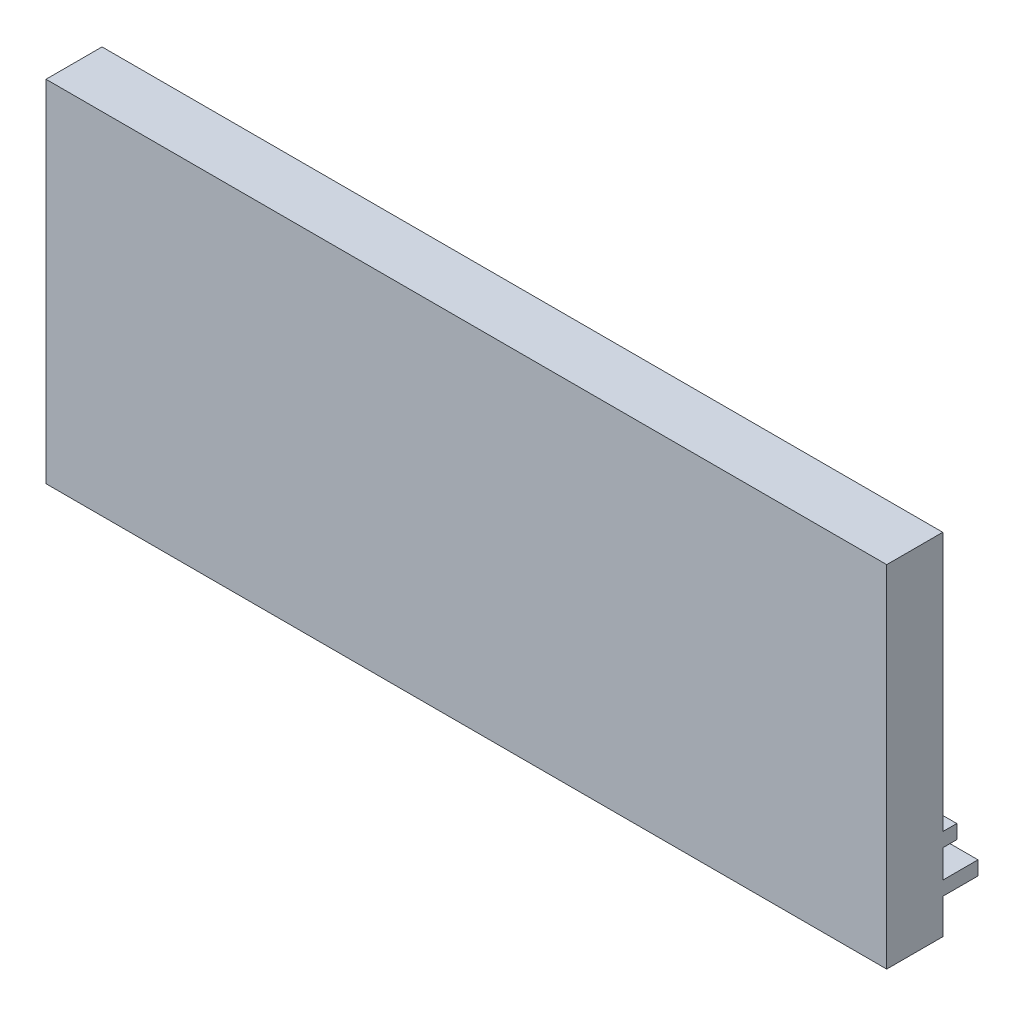
ISO-10303-21;
HEADER;
FILE_DESCRIPTION(('STEP AP214'),'2;1');
FILE_NAME('part.step','',(''),(''),'','','');
FILE_SCHEMA(('AUTOMOTIVE_DESIGN { 1 0 10303 214 1 1 1 1 }'));
ENDSEC;
DATA;
#1=APPLICATION_CONTEXT('core data for automotive mechanical design processes');
#2=APPLICATION_PROTOCOL_DEFINITION('international standard','automotive_design',2000,#1);
#3=PRODUCT_CONTEXT('',#1,'mechanical');
#4=PRODUCT('Part','Part','',(#3));
#5=PRODUCT_RELATED_PRODUCT_CATEGORY('part','',(#4));
#6=PRODUCT_DEFINITION_FORMATION('','',#4);
#7=PRODUCT_DEFINITION_CONTEXT('part definition',#1,'design');
#8=PRODUCT_DEFINITION('design','',#6,#7);
#9=PRODUCT_DEFINITION_SHAPE('','',#8);
#10=(LENGTH_UNIT() NAMED_UNIT(*) SI_UNIT(.MILLI.,.METRE.));
#11=(NAMED_UNIT(*) PLANE_ANGLE_UNIT() SI_UNIT($,.RADIAN.));
#12=(NAMED_UNIT(*) SI_UNIT($,.STERADIAN.) SOLID_ANGLE_UNIT());
#13=UNCERTAINTY_MEASURE_WITH_UNIT(LENGTH_MEASURE(1.E-05),#10,'distance_accuracy_value','');
#14=(GEOMETRIC_REPRESENTATION_CONTEXT(3) GLOBAL_UNCERTAINTY_ASSIGNED_CONTEXT((#13)) GLOBAL_UNIT_ASSIGNED_CONTEXT((#10,
#11,#12)) REPRESENTATION_CONTEXT('',''));
#15=CARTESIAN_POINT('',(0.,0.,0.));
#16=DIRECTION('',(0.,0.,1.));
#17=DIRECTION('',(1.,0.,0.));
#18=AXIS2_PLACEMENT_3D('',#15,#16,#17);
#19=CARTESIAN_POINT('',(0.,0.,0.));
#20=DIRECTION('',(0.,0.,1.));
#21=DIRECTION('',(1.,0.,0.));
#22=AXIS2_PLACEMENT_3D('',#19,#20,#21);
#23=PLANE('',#22);
#24=DIRECTION('',(-1.,0.,0.));
#25=VECTOR('',#24,1.);
#26=CARTESIAN_POINT('',(34.4162435328224,-4.77919281725888,0.));
#27=LINE('',#26,#25);
#28=CARTESIAN_POINT('',(34.4162435328224,-4.77919281725888,0.));
#29=VERTEX_POINT('',#28);
#30=CARTESIAN_POINT('',(-5.58375646717765,-4.77919281725888,0.));
#31=VERTEX_POINT('',#30);
#32=EDGE_CURVE('E256',#29,#31,#27,.T.);
#33=ORIENTED_EDGE('',*,*,#32,.F.);
#34=DIRECTION('',(0.,1.,0.));
#35=VECTOR('',#34,1.);
#36=CARTESIAN_POINT('',(34.4162436548223,14.7208121827411,0.));
#37=LINE('',#36,#35);
#38=CARTESIAN_POINT('',(34.4162435328223,-6.77919281725891,0.));
#39=VERTEX_POINT('',#38);
#40=EDGE_CURVE('E153',#39,#29,#37,.T.);
#41=ORIENTED_EDGE('',*,*,#40,.F.);
#42=DIRECTION('',(1.,0.,0.));
#43=VECTOR('',#42,1.);
#44=CARTESIAN_POINT('',(-5.58375646717766,-6.77919281725888,0.));
#45=LINE('',#44,#43);
#46=CARTESIAN_POINT('',(-5.58375646717766,-6.77919281725888,0.));
#47=VERTEX_POINT('',#46);
#48=EDGE_CURVE('E158',#47,#39,#45,.T.);
#49=ORIENTED_EDGE('',*,*,#48,.F.);
#50=DIRECTION('',(0.,1.,0.));
#51=VECTOR('',#50,1.);
#52=CARTESIAN_POINT('',(-5.58375646717766,-6.77919281725888,0.));
#53=LINE('',#52,#51);
#54=CARTESIAN_POINT('',(-5.58375646717766,-7.77919281725888,0.));
#55=VERTEX_POINT('',#54);
#56=EDGE_CURVE('E63',#55,#47,#53,.T.);
#57=ORIENTED_EDGE('',*,*,#56,.F.);
#58=DIRECTION('',(-1.,0.,0.));
#59=VECTOR('',#58,1.);
#60=CARTESIAN_POINT('',(-5.58375646717766,-7.77919281725888,0.));
#61=LINE('',#60,#59);
#62=CARTESIAN_POINT('',(34.4162436548223,-7.77919281725889,0.));
#63=VERTEX_POINT('',#62);
#64=EDGE_CURVE('E169',#63,#55,#61,.T.);
#65=ORIENTED_EDGE('',*,*,#64,.F.);
#66=CARTESIAN_POINT('',(34.4162436548223,-10.2791878172589,0.));
#67=VERTEX_POINT('',#66);
#68=EDGE_CURVE('E221',#67,#63,#37,.T.);
#69=ORIENTED_EDGE('',*,*,#68,.F.);
#70=DIRECTION('',(1.,0.,0.));
#71=VECTOR('',#70,1.);
#72=CARTESIAN_POINT('',(-25.5837563451777,-10.2791878172589,0.));
#73=LINE('',#72,#71);
#74=CARTESIAN_POINT('',(-25.5837563451777,-10.2791878172589,0.));
#75=VERTEX_POINT('',#74);
#76=EDGE_CURVE('E217',#75,#67,#73,.T.);
#77=ORIENTED_EDGE('',*,*,#76,.F.);
#78=DIRECTION('',(0.,-1.,0.));
#79=VECTOR('',#78,1.);
#80=CARTESIAN_POINT('',(-25.5837563451777,14.7208121827411,0.));
#81=LINE('',#80,#79);
#82=CARTESIAN_POINT('',(-25.5837563451777,14.7208121827411,0.));
#83=VERTEX_POINT('',#82);
#84=EDGE_CURVE('E198',#83,#75,#81,.T.);
#85=ORIENTED_EDGE('',*,*,#84,.F.);
#86=DIRECTION('',(-1.,0.,0.));
#87=VECTOR('',#86,1.);
#88=CARTESIAN_POINT('',(-25.5837563451777,14.7208121827411,0.));
#89=LINE('',#88,#87);
#90=CARTESIAN_POINT('',(34.4162436548223,14.7208121827411,0.));
#91=VERTEX_POINT('',#90);
#92=EDGE_CURVE('E204',#91,#83,#89,.T.);
#93=ORIENTED_EDGE('',*,*,#92,.F.);
#94=CARTESIAN_POINT('',(34.4162436548223,-3.77919281725888,0.));
#95=VERTEX_POINT('',#94);
#96=EDGE_CURVE('E220',#95,#91,#37,.T.);
#97=ORIENTED_EDGE('',*,*,#96,.F.);
#98=DIRECTION('',(1.,0.,0.));
#99=VECTOR('',#98,1.);
#100=CARTESIAN_POINT('',(34.4162435328224,-3.77919281725888,0.));
#101=LINE('',#100,#99);
#102=CARTESIAN_POINT('',(-5.58375646717766,-3.77919281725888,0.));
#103=VERTEX_POINT('',#102);
#104=EDGE_CURVE('E147',#103,#95,#101,.T.);
#105=ORIENTED_EDGE('',*,*,#104,.F.);
#106=DIRECTION('',(0.,1.,0.));
#107=VECTOR('',#106,1.);
#108=CARTESIAN_POINT('',(-5.58375646717766,-3.77919281725888,0.));
#109=LINE('',#108,#107);
#110=EDGE_CURVE('E395',#31,#103,#109,.T.);
#111=ORIENTED_EDGE('',*,*,#110,.F.);
#112=EDGE_LOOP('',(#33,#41,#49,#57,#65,#69,#77,#85,#93,#97,#105,#111));
#113=FACE_BOUND('',#112,.T.);
#114=ADVANCED_FACE('F39',(#113),#23,.F.);
#115=CARTESIAN_POINT('',(-25.5837563451777,14.7208121827411,4.));
#116=DIRECTION('',(1.,0.,0.));
#117=DIRECTION('',(0.,0.,-1.));
#118=AXIS2_PLACEMENT_3D('',#115,#116,#117);
#119=PLANE('',#118);
#120=ORIENTED_EDGE('',*,*,#84,.T.);
#121=DIRECTION('',(0.,0.,-1.));
#122=VECTOR('',#121,1.);
#123=CARTESIAN_POINT('',(-25.5837563451777,-10.2791878172589,4.));
#124=LINE('',#123,#122);
#125=CARTESIAN_POINT('',(-25.5837563451777,-10.2791878172589,4.));
#126=VERTEX_POINT('',#125);
#127=EDGE_CURVE('E11',#126,#75,#124,.T.);
#128=ORIENTED_EDGE('',*,*,#127,.F.);
#129=DIRECTION('',(0.,-1.,0.));
#130=VECTOR('',#129,1.);
#131=CARTESIAN_POINT('',(-25.5837563451777,14.7208121827411,4.));
#132=LINE('',#131,#130);
#133=CARTESIAN_POINT('',(-25.5837563451777,14.7208121827411,4.));
#134=VERTEX_POINT('',#133);
#135=EDGE_CURVE('E199',#134,#126,#132,.T.);
#136=ORIENTED_EDGE('',*,*,#135,.F.);
#137=DIRECTION('',(0.,0.,-1.));
#138=VECTOR('',#137,1.);
#139=CARTESIAN_POINT('',(-25.5837563451777,14.7208121827411,4.));
#140=LINE('',#139,#138);
#141=EDGE_CURVE('E213',#134,#83,#140,.T.);
#142=ORIENTED_EDGE('',*,*,#141,.T.);
#143=EDGE_LOOP('',(#120,#128,#136,#142));
#144=FACE_BOUND('',#143,.T.);
#145=ADVANCED_FACE('F41',(#144),#119,.F.);
#146=CARTESIAN_POINT('',(-25.5837563451777,-10.2791878172589,4.));
#147=DIRECTION('',(0.,1.,0.));
#148=DIRECTION('',(0.,0.,1.));
#149=AXIS2_PLACEMENT_3D('',#146,#147,#148);
#150=PLANE('',#149);
#151=ORIENTED_EDGE('',*,*,#76,.T.);
#152=DIRECTION('',(0.,0.,-1.));
#153=VECTOR('',#152,1.);
#154=CARTESIAN_POINT('',(34.4162436548223,-10.2791878172589,4.));
#155=LINE('',#154,#153);
#156=CARTESIAN_POINT('',(34.4162436548223,-10.2791878172589,4.));
#157=VERTEX_POINT('',#156);
#158=EDGE_CURVE('E48',#157,#67,#155,.T.);
#159=ORIENTED_EDGE('',*,*,#158,.F.);
#160=DIRECTION('',(1.,0.,0.));
#161=VECTOR('',#160,1.);
#162=CARTESIAN_POINT('',(-25.5837563451777,-10.2791878172589,4.));
#163=LINE('',#162,#161);
#164=EDGE_CURVE('E203',#126,#157,#163,.T.);
#165=ORIENTED_EDGE('',*,*,#164,.F.);
#166=ORIENTED_EDGE('',*,*,#127,.T.);
#167=EDGE_LOOP('',(#151,#159,#165,#166));
#168=FACE_BOUND('',#167,.T.);
#169=ADVANCED_FACE('F271',(#168),#150,.F.);
#170=CARTESIAN_POINT('',(34.4162436548223,14.7208121827411,4.));
#171=DIRECTION('',(-1.,0.,0.));
#172=DIRECTION('',(0.,0.,1.));
#173=AXIS2_PLACEMENT_3D('',#170,#171,#172);
#174=PLANE('',#173);
#175=ORIENTED_EDGE('',*,*,#68,.T.);
#176=DIRECTION('',(0.,0.,1.));
#177=VECTOR('',#176,1.);
#178=CARTESIAN_POINT('',(34.4162435328223,-7.77919281725889,-2.5146));
#179=LINE('',#178,#177);
#180=CARTESIAN_POINT('',(34.4162435328223,-7.77919281725889,-2.5146));
#181=VERTEX_POINT('',#180);
#182=EDGE_CURVE('E187',#181,#63,#179,.T.);
#183=ORIENTED_EDGE('',*,*,#182,.F.);
#184=DIRECTION('',(0.,-1.,0.));
#185=VECTOR('',#184,1.);
#186=CARTESIAN_POINT('',(34.4162435328223,-6.77919281725891,-2.5146));
#187=LINE('',#186,#185);
#188=CARTESIAN_POINT('',(34.4162435328223,-6.77919281725891,-2.5146));
#189=VERTEX_POINT('',#188);
#190=EDGE_CURVE('E172',#189,#181,#187,.T.);
#191=ORIENTED_EDGE('',*,*,#190,.F.);
#192=DIRECTION('',(0.,0.,1.));
#193=VECTOR('',#192,1.);
#194=CARTESIAN_POINT('',(34.4162435328223,-6.77919281725891,-2.5146));
#195=LINE('',#194,#193);
#196=EDGE_CURVE('E191',#189,#39,#195,.T.);
#197=ORIENTED_EDGE('',*,*,#196,.T.);
#198=ORIENTED_EDGE('',*,*,#40,.T.);
#199=DIRECTION('',(0.,0.,1.));
#200=VECTOR('',#199,1.);
#201=CARTESIAN_POINT('',(34.4162435328224,-4.77919281725888,-1.));
#202=LINE('',#201,#200);
#203=CARTESIAN_POINT('',(34.4162435328224,-4.77919281725888,-1.));
#204=VERTEX_POINT('',#203);
#205=EDGE_CURVE('E133',#204,#29,#202,.T.);
#206=ORIENTED_EDGE('',*,*,#205,.F.);
#207=DIRECTION('',(0.,-1.,0.));
#208=VECTOR('',#207,1.);
#209=CARTESIAN_POINT('',(34.4162435328224,-3.77919281725888,-1.));
#210=LINE('',#209,#208);
#211=CARTESIAN_POINT('',(34.4162435328224,-3.77919281725888,-1.));
#212=VERTEX_POINT('',#211);
#213=EDGE_CURVE('E141',#212,#204,#210,.T.);
#214=ORIENTED_EDGE('',*,*,#213,.F.);
#215=DIRECTION('',(0.,0.,1.));
#216=VECTOR('',#215,1.);
#217=CARTESIAN_POINT('',(34.4162435328224,-3.77919281725888,-1.));
#218=LINE('',#217,#216);
#219=EDGE_CURVE('E55',#212,#95,#218,.T.);
#220=ORIENTED_EDGE('',*,*,#219,.T.);
#221=ORIENTED_EDGE('',*,*,#96,.T.);
#222=DIRECTION('',(0.,0.,-1.));
#223=VECTOR('',#222,1.);
#224=CARTESIAN_POINT('',(34.4162436548223,14.7208121827411,4.));
#225=LINE('',#224,#223);
#226=CARTESIAN_POINT('',(34.4162436548223,14.7208121827411,4.));
#227=VERTEX_POINT('',#226);
#228=EDGE_CURVE('E229',#227,#91,#225,.T.);
#229=ORIENTED_EDGE('',*,*,#228,.F.);
#230=DIRECTION('',(0.,1.,0.));
#231=VECTOR('',#230,1.);
#232=CARTESIAN_POINT('',(34.4162436548223,14.7208121827411,4.));
#233=LINE('',#232,#231);
#234=EDGE_CURVE('E207',#157,#227,#233,.T.);
#235=ORIENTED_EDGE('',*,*,#234,.F.);
#236=ORIENTED_EDGE('',*,*,#158,.T.);
#237=EDGE_LOOP('',(#175,#183,#191,#197,#198,#206,#214,#220,#221,#229,#235,#236));
#238=FACE_BOUND('',#237,.T.);
#239=ADVANCED_FACE('F151',(#238),#174,.F.);
#240=CARTESIAN_POINT('',(-25.5837563451777,14.7208121827411,4.));
#241=DIRECTION('',(0.,-1.,0.));
#242=DIRECTION('',(0.,0.,-1.));
#243=AXIS2_PLACEMENT_3D('',#240,#241,#242);
#244=PLANE('',#243);
#245=ORIENTED_EDGE('',*,*,#92,.T.);
#246=ORIENTED_EDGE('',*,*,#141,.F.);
#247=DIRECTION('',(-1.,0.,0.));
#248=VECTOR('',#247,1.);
#249=CARTESIAN_POINT('',(-25.5837563451777,14.7208121827411,4.));
#250=LINE('',#249,#248);
#251=EDGE_CURVE('E210',#227,#134,#250,.T.);
#252=ORIENTED_EDGE('',*,*,#251,.F.);
#253=ORIENTED_EDGE('',*,*,#228,.T.);
#254=EDGE_LOOP('',(#245,#246,#252,#253));
#255=FACE_BOUND('',#254,.T.);
#256=ADVANCED_FACE('F264',(#255),#244,.F.);
#257=CARTESIAN_POINT('',(0.,0.,4.));
#258=DIRECTION('',(0.,0.,1.));
#259=DIRECTION('',(1.,0.,0.));
#260=AXIS2_PLACEMENT_3D('',#257,#258,#259);
#261=PLANE('',#260);
#262=ORIENTED_EDGE('',*,*,#135,.T.);
#263=ORIENTED_EDGE('',*,*,#164,.T.);
#264=ORIENTED_EDGE('',*,*,#234,.T.);
#265=ORIENTED_EDGE('',*,*,#251,.T.);
#266=EDGE_LOOP('',(#262,#263,#264,#265));
#267=FACE_BOUND('',#266,.T.);
#268=ADVANCED_FACE('F270',(#267),#261,.T.);
#269=CARTESIAN_POINT('',(-5.58375646717766,-6.77919281725888,-2.5146));
#270=DIRECTION('',(1.,0.,0.));
#271=DIRECTION('',(0.,0.,-1.));
#272=AXIS2_PLACEMENT_3D('',#269,#270,#271);
#273=PLANE('',#272);
#274=ORIENTED_EDGE('',*,*,#56,.T.);
#275=DIRECTION('',(0.,0.,1.));
#276=VECTOR('',#275,1.);
#277=CARTESIAN_POINT('',(-5.58375646717766,-6.77919281725888,-2.5146));
#278=LINE('',#277,#276);
#279=CARTESIAN_POINT('',(-5.58375646717766,-6.77919281725888,-2.5146));
#280=VERTEX_POINT('',#279);
#281=EDGE_CURVE('E194',#280,#47,#278,.T.);
#282=ORIENTED_EDGE('',*,*,#281,.F.);
#283=DIRECTION('',(0.,1.,0.));
#284=VECTOR('',#283,1.);
#285=CARTESIAN_POINT('',(-5.58375646717766,-6.77919281725888,-2.5146));
#286=LINE('',#285,#284);
#287=CARTESIAN_POINT('',(-5.58375646717766,-7.77919281725888,-2.5146));
#288=VERTEX_POINT('',#287);
#289=EDGE_CURVE('E164',#288,#280,#286,.T.);
#290=ORIENTED_EDGE('',*,*,#289,.F.);
#291=DIRECTION('',(0.,0.,1.));
#292=VECTOR('',#291,1.);
#293=CARTESIAN_POINT('',(-5.58375646717766,-7.77919281725888,-2.5146));
#294=LINE('',#293,#292);
#295=EDGE_CURVE('E177',#288,#55,#294,.T.);
#296=ORIENTED_EDGE('',*,*,#295,.T.);
#297=EDGE_LOOP('',(#274,#282,#290,#296));
#298=FACE_BOUND('',#297,.T.);
#299=ADVANCED_FACE('F247',(#298),#273,.F.);
#300=CARTESIAN_POINT('',(-5.58375646717766,-6.77919281725888,-2.5146));
#301=DIRECTION('',(0.,-1.,0.));
#302=DIRECTION('',(1.,0.,0.));
#303=AXIS2_PLACEMENT_3D('',#300,#301,#302);
#304=PLANE('',#303);
#305=ORIENTED_EDGE('',*,*,#48,.T.);
#306=ORIENTED_EDGE('',*,*,#196,.F.);
#307=DIRECTION('',(1.,0.,0.));
#308=VECTOR('',#307,1.);
#309=CARTESIAN_POINT('',(-5.58375646717766,-6.77919281725888,-2.5146));
#310=LINE('',#309,#308);
#311=EDGE_CURVE('E168',#280,#189,#310,.T.);
#312=ORIENTED_EDGE('',*,*,#311,.F.);
#313=ORIENTED_EDGE('',*,*,#281,.T.);
#314=EDGE_LOOP('',(#305,#306,#312,#313));
#315=FACE_BOUND('',#314,.T.);
#316=ADVANCED_FACE('F254',(#315),#304,.F.);
#317=CARTESIAN_POINT('',(-5.58375646717766,-7.77919281725888,-2.5146));
#318=DIRECTION('',(0.,1.,0.));
#319=DIRECTION('',(-1.,0.,0.));
#320=AXIS2_PLACEMENT_3D('',#317,#318,#319);
#321=PLANE('',#320);
#322=ORIENTED_EDGE('',*,*,#64,.T.);
#323=ORIENTED_EDGE('',*,*,#295,.F.);
#324=DIRECTION('',(-1.,0.,0.));
#325=VECTOR('',#324,1.);
#326=CARTESIAN_POINT('',(-5.58375646717766,-7.77919281725888,-2.5146));
#327=LINE('',#326,#325);
#328=EDGE_CURVE('E175',#181,#288,#327,.T.);
#329=ORIENTED_EDGE('',*,*,#328,.F.);
#330=ORIENTED_EDGE('',*,*,#182,.T.);
#331=EDGE_LOOP('',(#322,#323,#329,#330));
#332=FACE_BOUND('',#331,.T.);
#333=ADVANCED_FACE('F243',(#332),#321,.F.);
#334=CARTESIAN_POINT('',(0.,0.,-2.5146));
#335=DIRECTION('',(0.,0.,1.));
#336=DIRECTION('',(1.,0.,0.));
#337=AXIS2_PLACEMENT_3D('',#334,#335,#336);
#338=PLANE('',#337);
#339=ORIENTED_EDGE('',*,*,#289,.T.);
#340=ORIENTED_EDGE('',*,*,#311,.T.);
#341=ORIENTED_EDGE('',*,*,#190,.T.);
#342=ORIENTED_EDGE('',*,*,#328,.T.);
#343=EDGE_LOOP('',(#339,#340,#341,#342));
#344=FACE_BOUND('',#343,.T.);
#345=ADVANCED_FACE('F250',(#344),#338,.F.);
#346=CARTESIAN_POINT('',(34.4162435328224,-4.77919281725888,-1.));
#347=DIRECTION('',(0.,1.,0.));
#348=DIRECTION('',(0.,0.,1.));
#349=AXIS2_PLACEMENT_3D('',#346,#347,#348);
#350=PLANE('',#349);
#351=ORIENTED_EDGE('',*,*,#32,.T.);
#352=DIRECTION('',(0.,0.,1.));
#353=VECTOR('',#352,1.);
#354=CARTESIAN_POINT('',(-5.58375646717765,-4.77919281725888,-1.));
#355=LINE('',#354,#353);
#356=CARTESIAN_POINT('',(-5.58375646717765,-4.77919281725888,-1.));
#357=VERTEX_POINT('',#356);
#358=EDGE_CURVE('E136',#357,#31,#355,.T.);
#359=ORIENTED_EDGE('',*,*,#358,.F.);
#360=DIRECTION('',(-1.,0.,0.));
#361=VECTOR('',#360,1.);
#362=CARTESIAN_POINT('',(34.4162435328224,-4.77919281725888,-1.));
#363=LINE('',#362,#361);
#364=EDGE_CURVE('E129',#204,#357,#363,.T.);
#365=ORIENTED_EDGE('',*,*,#364,.F.);
#366=ORIENTED_EDGE('',*,*,#205,.T.);
#367=EDGE_LOOP('',(#351,#359,#365,#366));
#368=FACE_BOUND('',#367,.T.);
#369=ADVANCED_FACE('F131',(#368),#350,.F.);
#370=CARTESIAN_POINT('',(-5.58375646717766,-3.77919281725888,-1.));
#371=DIRECTION('',(1.,0.,0.));
#372=DIRECTION('',(0.,1.,0.));
#373=AXIS2_PLACEMENT_3D('',#370,#371,#372);
#374=PLANE('',#373);
#375=ORIENTED_EDGE('',*,*,#110,.T.);
#376=DIRECTION('',(0.,0.,1.));
#377=VECTOR('',#376,1.);
#378=CARTESIAN_POINT('',(-5.58375646717766,-3.77919281725888,-1.));
#379=LINE('',#378,#377);
#380=CARTESIAN_POINT('',(-5.58375646717766,-3.77919281725888,-1.));
#381=VERTEX_POINT('',#380);
#382=EDGE_CURVE('E160',#381,#103,#379,.T.);
#383=ORIENTED_EDGE('',*,*,#382,.F.);
#384=DIRECTION('',(0.,1.,0.));
#385=VECTOR('',#384,1.);
#386=CARTESIAN_POINT('',(-5.58375646717766,-3.77919281725888,-1.));
#387=LINE('',#386,#385);
#388=EDGE_CURVE('E140',#357,#381,#387,.T.);
#389=ORIENTED_EDGE('',*,*,#388,.F.);
#390=ORIENTED_EDGE('',*,*,#358,.T.);
#391=EDGE_LOOP('',(#375,#383,#389,#390));
#392=FACE_BOUND('',#391,.T.);
#393=ADVANCED_FACE('F303',(#392),#374,.F.);
#394=CARTESIAN_POINT('',(34.4162435328224,-3.77919281725888,-1.));
#395=DIRECTION('',(0.,-1.,0.));
#396=DIRECTION('',(0.,0.,-1.));
#397=AXIS2_PLACEMENT_3D('',#394,#395,#396);
#398=PLANE('',#397);
#399=ORIENTED_EDGE('',*,*,#104,.T.);
#400=ORIENTED_EDGE('',*,*,#219,.F.);
#401=DIRECTION('',(1.,0.,0.));
#402=VECTOR('',#401,1.);
#403=CARTESIAN_POINT('',(34.4162435328224,-3.77919281725888,-1.));
#404=LINE('',#403,#402);
#405=EDGE_CURVE('E145',#381,#212,#404,.T.);
#406=ORIENTED_EDGE('',*,*,#405,.F.);
#407=ORIENTED_EDGE('',*,*,#382,.T.);
#408=EDGE_LOOP('',(#399,#400,#406,#407));
#409=FACE_BOUND('',#408,.T.);
#410=ADVANCED_FACE('F306',(#409),#398,.F.);
#411=CARTESIAN_POINT('',(0.,0.,-1.));
#412=DIRECTION('',(0.,0.,-1.));
#413=DIRECTION('',(-1.,0.,0.));
#414=AXIS2_PLACEMENT_3D('',#411,#412,#413);
#415=PLANE('',#414);
#416=ORIENTED_EDGE('',*,*,#213,.T.);
#417=ORIENTED_EDGE('',*,*,#364,.T.);
#418=ORIENTED_EDGE('',*,*,#388,.T.);
#419=ORIENTED_EDGE('',*,*,#405,.T.);
#420=EDGE_LOOP('',(#416,#417,#418,#419));
#421=FACE_BOUND('',#420,.T.);
#422=ADVANCED_FACE('F143',(#421),#415,.T.);
#423=CLOSED_SHELL('',(#114,#145,#169,#239,#256,#268,#299,#316,#333,#345,#369,#393,#410,#422));
#424=MANIFOLD_SOLID_BREP('B2',#423);
#425=ADVANCED_BREP_SHAPE_REPRESENTATION('',(#18,#424),#14);
#426=SHAPE_DEFINITION_REPRESENTATION(#9,#425);
ENDSEC;
END-ISO-10303-21;
